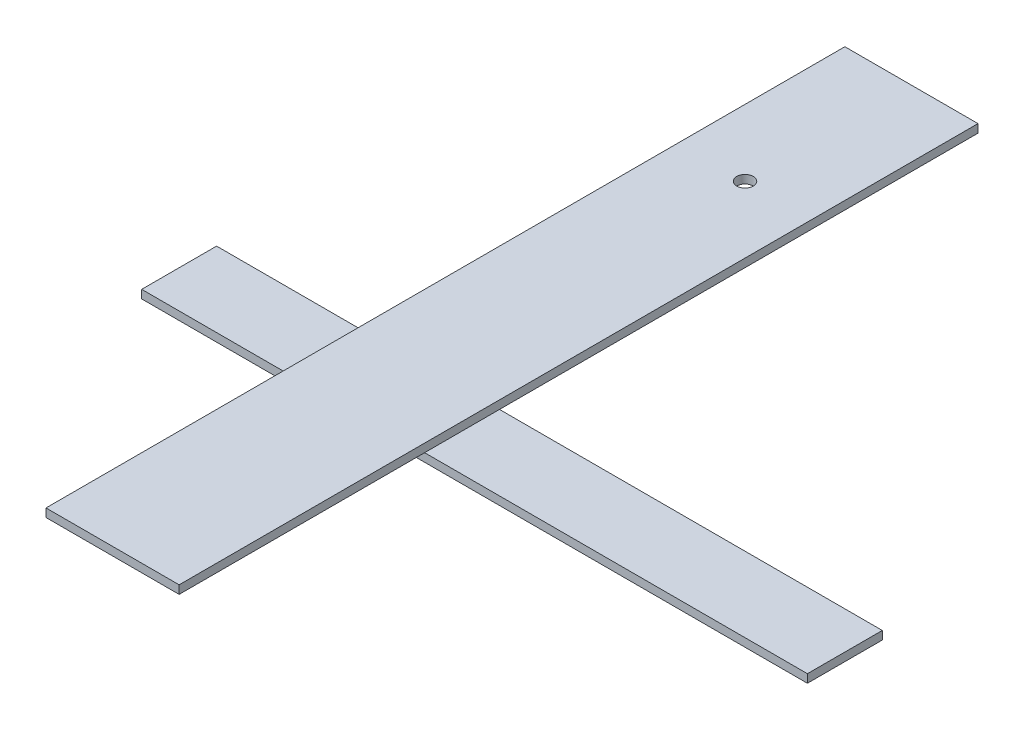
ISO-10303-21;
HEADER;
FILE_DESCRIPTION(('STEP AP214'),'2;1');
FILE_NAME('part.step','',(''),(''),'','','');
FILE_SCHEMA(('AUTOMOTIVE_DESIGN { 1 0 10303 214 1 1 1 1 }'));
ENDSEC;
DATA;
#1=APPLICATION_CONTEXT('core data for automotive mechanical design processes');
#2=APPLICATION_PROTOCOL_DEFINITION('international standard','automotive_design',2000,#1);
#3=PRODUCT_CONTEXT('',#1,'mechanical');
#4=PRODUCT('Part','Part','',(#3));
#5=PRODUCT_RELATED_PRODUCT_CATEGORY('part','',(#4));
#6=PRODUCT_DEFINITION_FORMATION('','',#4);
#7=PRODUCT_DEFINITION_CONTEXT('part definition',#1,'design');
#8=PRODUCT_DEFINITION('design','',#6,#7);
#9=PRODUCT_DEFINITION_SHAPE('','',#8);
#10=(LENGTH_UNIT() NAMED_UNIT(*) SI_UNIT(.MILLI.,.METRE.));
#11=(NAMED_UNIT(*) PLANE_ANGLE_UNIT() SI_UNIT($,.RADIAN.));
#12=(NAMED_UNIT(*) SI_UNIT($,.STERADIAN.) SOLID_ANGLE_UNIT());
#13=UNCERTAINTY_MEASURE_WITH_UNIT(LENGTH_MEASURE(1.E-05),#10,'distance_accuracy_value','');
#14=(GEOMETRIC_REPRESENTATION_CONTEXT(3) GLOBAL_UNCERTAINTY_ASSIGNED_CONTEXT((#13)) GLOBAL_UNIT_ASSIGNED_CONTEXT((#10,
#11,#12)) REPRESENTATION_CONTEXT('',''));
#15=CARTESIAN_POINT('',(0.,0.,0.));
#16=DIRECTION('',(0.,0.,1.));
#17=DIRECTION('',(1.,0.,0.));
#18=AXIS2_PLACEMENT_3D('',#15,#16,#17);
#19=CARTESIAN_POINT('',(-50.8,101.6,304.8));
#20=DIRECTION('',(1.,0.,0.));
#21=DIRECTION('',(0.,1.,0.));
#22=AXIS2_PLACEMENT_3D('',#19,#20,#21);
#23=PLANE('',#22);
#24=DIRECTION('',(0.,-1.,0.));
#25=VECTOR('',#24,1.);
#26=CARTESIAN_POINT('',(-50.8,101.6,-304.8));
#27=LINE('',#26,#25);
#28=CARTESIAN_POINT('',(-50.8,101.6,-304.8));
#29=VERTEX_POINT('',#28);
#30=CARTESIAN_POINT('',(-50.8,95.25,-304.8));
#31=VERTEX_POINT('',#30);
#32=EDGE_CURVE('E106',#29,#31,#27,.T.);
#33=ORIENTED_EDGE('',*,*,#32,.T.);
#34=DIRECTION('',(0.,0.,-1.));
#35=VECTOR('',#34,1.);
#36=CARTESIAN_POINT('',(-50.8,95.25,304.8));
#37=LINE('',#36,#35);
#38=CARTESIAN_POINT('',(-50.8,95.25,304.8));
#39=VERTEX_POINT('',#38);
#40=EDGE_CURVE('E12',#39,#31,#37,.T.);
#41=ORIENTED_EDGE('',*,*,#40,.F.);
#42=DIRECTION('',(0.,-1.,0.));
#43=VECTOR('',#42,1.);
#44=CARTESIAN_POINT('',(-50.8,101.6,304.8));
#45=LINE('',#44,#43);
#46=CARTESIAN_POINT('',(-50.8,101.6,304.8));
#47=VERTEX_POINT('',#46);
#48=EDGE_CURVE('E94',#47,#39,#45,.T.);
#49=ORIENTED_EDGE('',*,*,#48,.F.);
#50=DIRECTION('',(0.,0.,-1.));
#51=VECTOR('',#50,1.);
#52=CARTESIAN_POINT('',(-50.8,101.6,304.8));
#53=LINE('',#52,#51);
#54=EDGE_CURVE('E102',#47,#29,#53,.T.);
#55=ORIENTED_EDGE('',*,*,#54,.T.);
#56=EDGE_LOOP('',(#33,#41,#49,#55));
#57=FACE_BOUND('',#56,.T.);
#58=ADVANCED_FACE('F43',(#57),#23,.F.);
#59=CARTESIAN_POINT('',(-50.8,95.25,304.8));
#60=DIRECTION('',(0.,1.,0.));
#61=DIRECTION('',(0.,0.,1.));
#62=AXIS2_PLACEMENT_3D('',#59,#60,#61);
#63=PLANE('',#62);
#64=CARTESIAN_POINT('',(0.,95.25,-177.8));
#65=DIRECTION('',(0.,1.,0.));
#66=DIRECTION('',(0.,0.,1.));
#67=AXIS2_PLACEMENT_3D('',#64,#65,#66);
#68=CIRCLE('',#67,6.35);
#69=CARTESIAN_POINT('',(0.,95.25,-171.45));
#70=VERTEX_POINT('',#69);
#71=EDGE_CURVE('E109',#70,#70,#68,.F.);
#72=ORIENTED_EDGE('',*,*,#71,.F.);
#73=EDGE_LOOP('',(#72));
#74=FACE_BOUND('',#73,.T.);
#75=DIRECTION('',(1.,0.,0.));
#76=VECTOR('',#75,1.);
#77=CARTESIAN_POINT('',(-50.8,95.25,-304.8));
#78=LINE('',#77,#76);
#79=CARTESIAN_POINT('',(50.8,95.25,-304.8));
#80=VERTEX_POINT('',#79);
#81=EDGE_CURVE('E98',#31,#80,#78,.T.);
#82=ORIENTED_EDGE('',*,*,#81,.T.);
#83=DIRECTION('',(0.,0.,-1.));
#84=VECTOR('',#83,1.);
#85=CARTESIAN_POINT('',(50.8,95.25,304.8));
#86=LINE('',#85,#84);
#87=CARTESIAN_POINT('',(50.8,95.25,304.8));
#88=VERTEX_POINT('',#87);
#89=EDGE_CURVE('E51',#88,#80,#86,.T.);
#90=ORIENTED_EDGE('',*,*,#89,.F.);
#91=DIRECTION('',(1.,0.,0.));
#92=VECTOR('',#91,1.);
#93=CARTESIAN_POINT('',(-50.8,95.25,304.8));
#94=LINE('',#93,#92);
#95=EDGE_CURVE('E89',#39,#88,#94,.T.);
#96=ORIENTED_EDGE('',*,*,#95,.F.);
#97=ORIENTED_EDGE('',*,*,#40,.T.);
#98=EDGE_LOOP('',(#82,#90,#96,#97));
#99=FACE_BOUND('',#98,.T.);
#100=ADVANCED_FACE('F97',(#74,#99),#63,.F.);
#101=CARTESIAN_POINT('',(50.8,101.6,304.8));
#102=DIRECTION('',(-1.,0.,0.));
#103=DIRECTION('',(0.,-1.,0.));
#104=AXIS2_PLACEMENT_3D('',#101,#102,#103);
#105=PLANE('',#104);
#106=DIRECTION('',(0.,1.,0.));
#107=VECTOR('',#106,1.);
#108=CARTESIAN_POINT('',(50.8,101.6,-304.8));
#109=LINE('',#108,#107);
#110=CARTESIAN_POINT('',(50.8,101.6,-304.8));
#111=VERTEX_POINT('',#110);
#112=EDGE_CURVE('E76',#80,#111,#109,.T.);
#113=ORIENTED_EDGE('',*,*,#112,.T.);
#114=DIRECTION('',(0.,0.,-1.));
#115=VECTOR('',#114,1.);
#116=CARTESIAN_POINT('',(50.8,101.6,304.8));
#117=LINE('',#116,#115);
#118=CARTESIAN_POINT('',(50.8,101.6,304.8));
#119=VERTEX_POINT('',#118);
#120=EDGE_CURVE('E99',#119,#111,#117,.T.);
#121=ORIENTED_EDGE('',*,*,#120,.F.);
#122=DIRECTION('',(0.,1.,0.));
#123=VECTOR('',#122,1.);
#124=CARTESIAN_POINT('',(50.8,101.6,304.8));
#125=LINE('',#124,#123);
#126=EDGE_CURVE('E92',#88,#119,#125,.T.);
#127=ORIENTED_EDGE('',*,*,#126,.F.);
#128=ORIENTED_EDGE('',*,*,#89,.T.);
#129=EDGE_LOOP('',(#113,#121,#127,#128));
#130=FACE_BOUND('',#129,.T.);
#131=ADVANCED_FACE('F100',(#130),#105,.F.);
#132=CARTESIAN_POINT('',(-50.8,101.6,304.8));
#133=DIRECTION('',(0.,-1.,0.));
#134=DIRECTION('',(0.,0.,-1.));
#135=AXIS2_PLACEMENT_3D('',#132,#133,#134);
#136=PLANE('',#135);
#137=CARTESIAN_POINT('',(0.,101.6,-177.8));
#138=DIRECTION('',(0.,1.,0.));
#139=DIRECTION('',(0.,0.,1.));
#140=AXIS2_PLACEMENT_3D('',#137,#138,#139);
#141=CIRCLE('',#140,6.35);
#142=CARTESIAN_POINT('',(0.,101.6,-171.45));
#143=VERTEX_POINT('',#142);
#144=EDGE_CURVE('E122',#143,#143,#141,.T.);
#145=ORIENTED_EDGE('',*,*,#144,.F.);
#146=EDGE_LOOP('',(#145));
#147=FACE_BOUND('',#146,.T.);
#148=DIRECTION('',(-1.,0.,0.));
#149=VECTOR('',#148,1.);
#150=CARTESIAN_POINT('',(-50.8,101.6,-304.8));
#151=LINE('',#150,#149);
#152=EDGE_CURVE('E82',#111,#29,#151,.T.);
#153=ORIENTED_EDGE('',*,*,#152,.T.);
#154=ORIENTED_EDGE('',*,*,#54,.F.);
#155=DIRECTION('',(-1.,0.,0.));
#156=VECTOR('',#155,1.);
#157=CARTESIAN_POINT('',(-50.8,101.6,304.8));
#158=LINE('',#157,#156);
#159=EDGE_CURVE('E59',#119,#47,#158,.T.);
#160=ORIENTED_EDGE('',*,*,#159,.F.);
#161=ORIENTED_EDGE('',*,*,#120,.T.);
#162=EDGE_LOOP('',(#153,#154,#160,#161));
#163=FACE_BOUND('',#162,.T.);
#164=ADVANCED_FACE('F114',(#147,#163),#136,.F.);
#165=CARTESIAN_POINT('',(0.,0.,304.8));
#166=DIRECTION('',(0.,0.,1.));
#167=DIRECTION('',(1.,0.,0.));
#168=AXIS2_PLACEMENT_3D('',#165,#166,#167);
#169=PLANE('',#168);
#170=ORIENTED_EDGE('',*,*,#48,.T.);
#171=ORIENTED_EDGE('',*,*,#95,.T.);
#172=ORIENTED_EDGE('',*,*,#126,.T.);
#173=ORIENTED_EDGE('',*,*,#159,.T.);
#174=EDGE_LOOP('',(#170,#171,#172,#173));
#175=FACE_BOUND('',#174,.T.);
#176=ADVANCED_FACE('F90',(#175),#169,.T.);
#177=CARTESIAN_POINT('',(0.,0.,-304.8));
#178=DIRECTION('',(0.,0.,1.));
#179=DIRECTION('',(1.,0.,0.));
#180=AXIS2_PLACEMENT_3D('',#177,#178,#179);
#181=PLANE('',#180);
#182=ORIENTED_EDGE('',*,*,#32,.F.);
#183=ORIENTED_EDGE('',*,*,#152,.F.);
#184=ORIENTED_EDGE('',*,*,#112,.F.);
#185=ORIENTED_EDGE('',*,*,#81,.F.);
#186=EDGE_LOOP('',(#182,#183,#184,#185));
#187=FACE_BOUND('',#186,.T.);
#188=ADVANCED_FACE('F117',(#187),#181,.F.);
#189=CARTESIAN_POINT('',(0.,-0.001000000000001,-177.8));
#190=DIRECTION('',(0.,1.,0.));
#191=DIRECTION('',(0.,0.,1.));
#192=AXIS2_PLACEMENT_3D('',#189,#190,#191);
#193=CYLINDRICAL_SURFACE('',#192,6.35);
#194=ORIENTED_EDGE('',*,*,#144,.T.);
#195=EDGE_LOOP('',(#194));
#196=FACE_BOUND('',#195,.T.);
#197=ORIENTED_EDGE('',*,*,#71,.T.);
#198=EDGE_LOOP('',(#197));
#199=FACE_BOUND('',#198,.T.);
#200=ADVANCED_FACE('F126',(#196,#199),#193,.F.);
#201=CLOSED_SHELL('',(#58,#100,#131,#164,#176,#188,#200));
#202=MANIFOLD_SOLID_BREP('B2',#201);
#203=CARTESIAN_POINT('',(254.,6.35,28.575));
#204=DIRECTION('',(0.,0.,-1.));
#205=DIRECTION('',(0.,1.,0.));
#206=AXIS2_PLACEMENT_3D('',#203,#204,#205);
#207=PLANE('',#206);
#208=DIRECTION('',(0.,-1.,0.));
#209=VECTOR('',#208,1.);
#210=CARTESIAN_POINT('',(-254.,6.35,28.575));
#211=LINE('',#210,#209);
#212=CARTESIAN_POINT('',(-254.,6.35,28.575));
#213=VERTEX_POINT('',#212);
#214=CARTESIAN_POINT('',(-254.,0.,28.575));
#215=VERTEX_POINT('',#214);
#216=EDGE_CURVE('E250',#213,#215,#211,.T.);
#217=ORIENTED_EDGE('',*,*,#216,.T.);
#218=DIRECTION('',(-1.,0.,0.));
#219=VECTOR('',#218,1.);
#220=CARTESIAN_POINT('',(254.,0.,28.575));
#221=LINE('',#220,#219);
#222=CARTESIAN_POINT('',(254.,0.,28.575));
#223=VERTEX_POINT('',#222);
#224=EDGE_CURVE('E41',#223,#215,#221,.T.);
#225=ORIENTED_EDGE('',*,*,#224,.F.);
#226=DIRECTION('',(0.,-1.,0.));
#227=VECTOR('',#226,1.);
#228=CARTESIAN_POINT('',(254.,6.35,28.575));
#229=LINE('',#228,#227);
#230=CARTESIAN_POINT('',(254.,6.35,28.575));
#231=VERTEX_POINT('',#230);
#232=EDGE_CURVE('E238',#231,#223,#229,.T.);
#233=ORIENTED_EDGE('',*,*,#232,.F.);
#234=DIRECTION('',(-1.,0.,0.));
#235=VECTOR('',#234,1.);
#236=CARTESIAN_POINT('',(254.,6.35,28.575));
#237=LINE('',#236,#235);
#238=EDGE_CURVE('E246',#231,#213,#237,.T.);
#239=ORIENTED_EDGE('',*,*,#238,.T.);
#240=EDGE_LOOP('',(#217,#225,#233,#239));
#241=FACE_BOUND('',#240,.T.);
#242=ADVANCED_FACE('F187',(#241),#207,.F.);
#243=CARTESIAN_POINT('',(254.,0.,28.575));
#244=DIRECTION('',(0.,1.,0.));
#245=DIRECTION('',(0.,0.,1.));
#246=AXIS2_PLACEMENT_3D('',#243,#244,#245);
#247=PLANE('',#246);
#248=DIRECTION('',(0.,0.,-1.));
#249=VECTOR('',#248,1.);
#250=CARTESIAN_POINT('',(-254.,0.,28.575));
#251=LINE('',#250,#249);
#252=CARTESIAN_POINT('',(-254.,0.,-28.575));
#253=VERTEX_POINT('',#252);
#254=EDGE_CURVE('E242',#215,#253,#251,.T.);
#255=ORIENTED_EDGE('',*,*,#254,.T.);
#256=DIRECTION('',(-1.,0.,0.));
#257=VECTOR('',#256,1.);
#258=CARTESIAN_POINT('',(254.,0.,-28.575));
#259=LINE('',#258,#257);
#260=CARTESIAN_POINT('',(254.,0.,-28.575));
#261=VERTEX_POINT('',#260);
#262=EDGE_CURVE('E195',#261,#253,#259,.T.);
#263=ORIENTED_EDGE('',*,*,#262,.F.);
#264=DIRECTION('',(0.,0.,-1.));
#265=VECTOR('',#264,1.);
#266=CARTESIAN_POINT('',(254.,0.,28.575));
#267=LINE('',#266,#265);
#268=EDGE_CURVE('E233',#223,#261,#267,.T.);
#269=ORIENTED_EDGE('',*,*,#268,.F.);
#270=ORIENTED_EDGE('',*,*,#224,.T.);
#271=EDGE_LOOP('',(#255,#263,#269,#270));
#272=FACE_BOUND('',#271,.T.);
#273=ADVANCED_FACE('F241',(#272),#247,.F.);
#274=CARTESIAN_POINT('',(254.,6.35,-28.575));
#275=DIRECTION('',(0.,0.,1.));
#276=DIRECTION('',(0.,-1.,0.));
#277=AXIS2_PLACEMENT_3D('',#274,#275,#276);
#278=PLANE('',#277);
#279=DIRECTION('',(0.,1.,0.));
#280=VECTOR('',#279,1.);
#281=CARTESIAN_POINT('',(-254.,6.35,-28.575));
#282=LINE('',#281,#280);
#283=CARTESIAN_POINT('',(-254.,6.35,-28.575));
#284=VERTEX_POINT('',#283);
#285=EDGE_CURVE('E220',#253,#284,#282,.T.);
#286=ORIENTED_EDGE('',*,*,#285,.T.);
#287=DIRECTION('',(-1.,0.,0.));
#288=VECTOR('',#287,1.);
#289=CARTESIAN_POINT('',(254.,6.35,-28.575));
#290=LINE('',#289,#288);
#291=CARTESIAN_POINT('',(254.,6.35,-28.575));
#292=VERTEX_POINT('',#291);
#293=EDGE_CURVE('E243',#292,#284,#290,.T.);
#294=ORIENTED_EDGE('',*,*,#293,.F.);
#295=DIRECTION('',(0.,1.,0.));
#296=VECTOR('',#295,1.);
#297=CARTESIAN_POINT('',(254.,6.35,-28.575));
#298=LINE('',#297,#296);
#299=EDGE_CURVE('E236',#261,#292,#298,.T.);
#300=ORIENTED_EDGE('',*,*,#299,.F.);
#301=ORIENTED_EDGE('',*,*,#262,.T.);
#302=EDGE_LOOP('',(#286,#294,#300,#301));
#303=FACE_BOUND('',#302,.T.);
#304=ADVANCED_FACE('F244',(#303),#278,.F.);
#305=CARTESIAN_POINT('',(254.,6.35,28.575));
#306=DIRECTION('',(0.,-1.,0.));
#307=DIRECTION('',(0.,0.,-1.));
#308=AXIS2_PLACEMENT_3D('',#305,#306,#307);
#309=PLANE('',#308);
#310=DIRECTION('',(0.,0.,1.));
#311=VECTOR('',#310,1.);
#312=CARTESIAN_POINT('',(-254.,6.35,28.575));
#313=LINE('',#312,#311);
#314=EDGE_CURVE('E226',#284,#213,#313,.T.);
#315=ORIENTED_EDGE('',*,*,#314,.T.);
#316=ORIENTED_EDGE('',*,*,#238,.F.);
#317=DIRECTION('',(0.,0.,1.));
#318=VECTOR('',#317,1.);
#319=CARTESIAN_POINT('',(254.,6.35,28.575));
#320=LINE('',#319,#318);
#321=EDGE_CURVE('E203',#292,#231,#320,.T.);
#322=ORIENTED_EDGE('',*,*,#321,.F.);
#323=ORIENTED_EDGE('',*,*,#293,.T.);
#324=EDGE_LOOP('',(#315,#316,#322,#323));
#325=FACE_BOUND('',#324,.T.);
#326=ADVANCED_FACE('F257',(#325),#309,.F.);
#327=CARTESIAN_POINT('',(254.,0.,0.));
#328=DIRECTION('',(1.,0.,0.));
#329=DIRECTION('',(0.,0.,-1.));
#330=AXIS2_PLACEMENT_3D('',#327,#328,#329);
#331=PLANE('',#330);
#332=ORIENTED_EDGE('',*,*,#232,.T.);
#333=ORIENTED_EDGE('',*,*,#268,.T.);
#334=ORIENTED_EDGE('',*,*,#299,.T.);
#335=ORIENTED_EDGE('',*,*,#321,.T.);
#336=EDGE_LOOP('',(#332,#333,#334,#335));
#337=FACE_BOUND('',#336,.T.);
#338=ADVANCED_FACE('F234',(#337),#331,.T.);
#339=CARTESIAN_POINT('',(-254.,0.,0.));
#340=DIRECTION('',(1.,0.,0.));
#341=DIRECTION('',(0.,0.,-1.));
#342=AXIS2_PLACEMENT_3D('',#339,#340,#341);
#343=PLANE('',#342);
#344=ORIENTED_EDGE('',*,*,#216,.F.);
#345=ORIENTED_EDGE('',*,*,#314,.F.);
#346=ORIENTED_EDGE('',*,*,#285,.F.);
#347=ORIENTED_EDGE('',*,*,#254,.F.);
#348=EDGE_LOOP('',(#344,#345,#346,#347));
#349=FACE_BOUND('',#348,.T.);
#350=ADVANCED_FACE('F260',(#349),#343,.F.);
#351=CLOSED_SHELL('',(#242,#273,#304,#326,#338,#350));
#352=MANIFOLD_SOLID_BREP('B6',#351);
#353=ADVANCED_BREP_SHAPE_REPRESENTATION('',(#18,#202,#352),#14);
#354=SHAPE_DEFINITION_REPRESENTATION(#9,#353);
ENDSEC;
END-ISO-10303-21;
